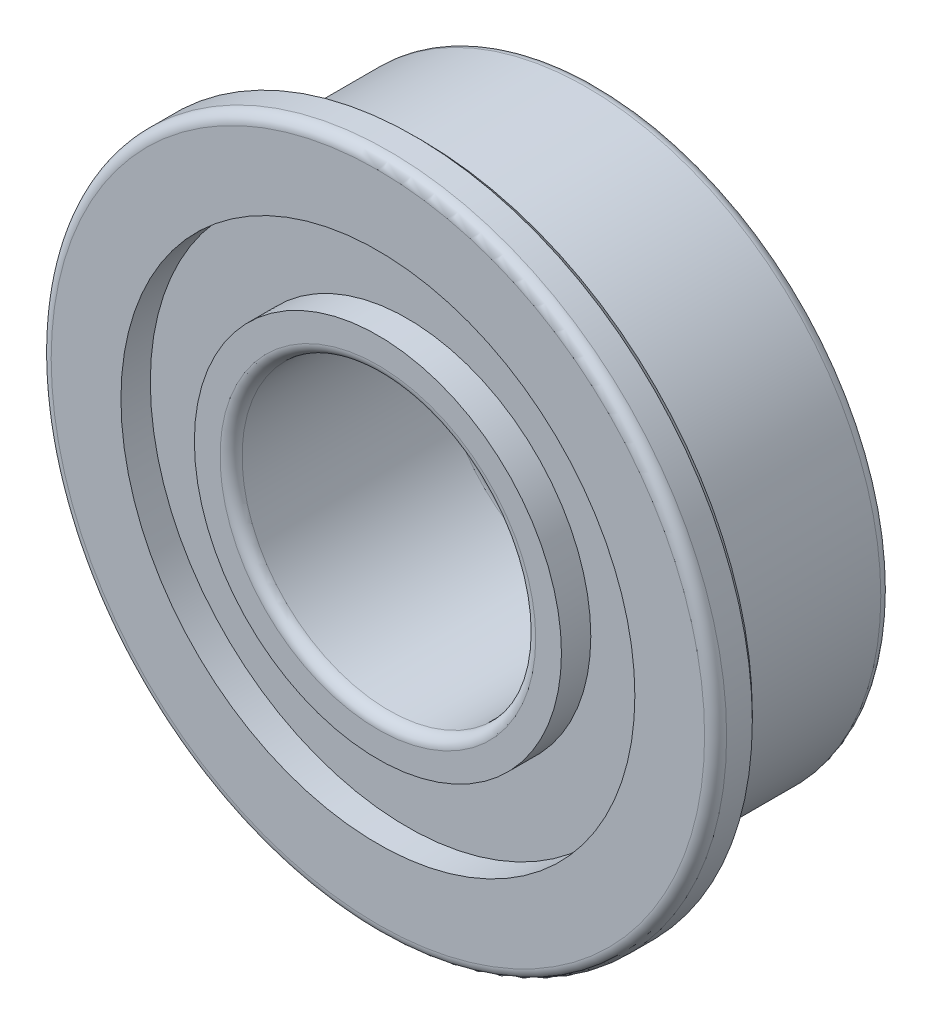
ISO-10303-21;
HEADER;
FILE_DESCRIPTION(('STEP AP214'),'2;1');
FILE_NAME('part.step','',(''),(''),'','','');
FILE_SCHEMA(('AUTOMOTIVE_DESIGN { 1 0 10303 214 1 1 1 1 }'));
ENDSEC;
DATA;
#1=APPLICATION_CONTEXT('core data for automotive mechanical design processes');
#2=APPLICATION_PROTOCOL_DEFINITION('international standard','automotive_design',2000,#1);
#3=PRODUCT_CONTEXT('',#1,'mechanical');
#4=PRODUCT('Part','Part','',(#3));
#5=PRODUCT_RELATED_PRODUCT_CATEGORY('part','',(#4));
#6=PRODUCT_DEFINITION_FORMATION('','',#4);
#7=PRODUCT_DEFINITION_CONTEXT('part definition',#1,'design');
#8=PRODUCT_DEFINITION('design','',#6,#7);
#9=PRODUCT_DEFINITION_SHAPE('','',#8);
#10=(LENGTH_UNIT() NAMED_UNIT(*) SI_UNIT(.MILLI.,.METRE.));
#11=(NAMED_UNIT(*) PLANE_ANGLE_UNIT() SI_UNIT($,.RADIAN.));
#12=(NAMED_UNIT(*) SI_UNIT($,.STERADIAN.) SOLID_ANGLE_UNIT());
#13=UNCERTAINTY_MEASURE_WITH_UNIT(LENGTH_MEASURE(1.E-05),#10,'distance_accuracy_value','');
#14=(GEOMETRIC_REPRESENTATION_CONTEXT(3) GLOBAL_UNCERTAINTY_ASSIGNED_CONTEXT((#13)) GLOBAL_UNIT_ASSIGNED_CONTEXT((#10,
#11,#12)) REPRESENTATION_CONTEXT('',''));
#15=CARTESIAN_POINT('',(0.,0.,0.));
#16=DIRECTION('',(0.,0.,1.));
#17=DIRECTION('',(1.,0.,0.));
#18=AXIS2_PLACEMENT_3D('',#15,#16,#17);
#19=CARTESIAN_POINT('',(0.,0.,3.));
#20=DIRECTION('',(0.,0.,1.));
#21=DIRECTION('',(1.,0.,0.));
#22=AXIS2_PLACEMENT_3D('',#19,#20,#21);
#23=PLANE('',#22);
#24=CARTESIAN_POINT('',(0.,0.,3.));
#25=DIRECTION('',(0.,0.,1.));
#26=DIRECTION('',(1.,0.,0.));
#27=AXIS2_PLACEMENT_3D('',#24,#25,#26);
#28=CIRCLE('',#27,2.15);
#29=CARTESIAN_POINT('',(2.15,0.,3.));
#30=VERTEX_POINT('',#29);
#31=EDGE_CURVE('E59',#30,#30,#28,.F.);
#32=ORIENTED_EDGE('',*,*,#31,.T.);
#33=EDGE_LOOP('',(#32));
#34=FACE_BOUND('',#33,.T.);
#35=CARTESIAN_POINT('',(0.,0.,3.));
#36=DIRECTION('',(0.,0.,1.));
#37=DIRECTION('',(1.,0.,0.));
#38=AXIS2_PLACEMENT_3D('',#35,#36,#37);
#39=CIRCLE('',#38,2.5);
#40=CARTESIAN_POINT('',(2.5,0.,3.));
#41=VERTEX_POINT('',#40);
#42=EDGE_CURVE('E102',#41,#41,#39,.T.);
#43=ORIENTED_EDGE('',*,*,#42,.T.);
#44=EDGE_LOOP('',(#43));
#45=FACE_BOUND('',#44,.T.);
#46=ADVANCED_FACE('F39',(#34,#45),#23,.T.);
#47=CARTESIAN_POINT('',(0.,0.,0.));
#48=DIRECTION('',(0.,0.,1.));
#49=DIRECTION('',(1.,0.,0.));
#50=AXIS2_PLACEMENT_3D('',#47,#48,#49);
#51=PLANE('',#50);
#52=CARTESIAN_POINT('',(0.,0.,0.));
#53=DIRECTION('',(0.,0.,1.));
#54=DIRECTION('',(1.,0.,0.));
#55=AXIS2_PLACEMENT_3D('',#52,#53,#54);
#56=CIRCLE('',#55,2.35);
#57=CARTESIAN_POINT('',(2.35,0.,0.));
#58=VERTEX_POINT('',#57);
#59=EDGE_CURVE('E77',#58,#58,#56,.F.);
#60=ORIENTED_EDGE('',*,*,#59,.T.);
#61=EDGE_LOOP('',(#60));
#62=FACE_BOUND('',#61,.T.);
#63=CARTESIAN_POINT('',(0.,0.,0.));
#64=DIRECTION('',(0.,0.,1.));
#65=DIRECTION('',(1.,0.,0.));
#66=AXIS2_PLACEMENT_3D('',#63,#64,#65);
#67=CIRCLE('',#66,2.15);
#68=CARTESIAN_POINT('',(2.15,0.,0.));
#69=VERTEX_POINT('',#68);
#70=EDGE_CURVE('E80',#69,#69,#67,.T.);
#71=ORIENTED_EDGE('',*,*,#70,.T.);
#72=EDGE_LOOP('',(#71));
#73=FACE_BOUND('',#72,.T.);
#74=ADVANCED_FACE('F137',(#62,#73),#51,.F.);
#75=CARTESIAN_POINT('',(0.,0.,3.));
#76=DIRECTION('',(0.,0.,-1.));
#77=DIRECTION('',(-1.,0.,0.));
#78=AXIS2_PLACEMENT_3D('',#75,#76,#77);
#79=CYLINDRICAL_SURFACE('',#78,4.);
#80=CARTESIAN_POINT('',(0.,0.,0.15));
#81=DIRECTION('',(0.,0.,1.));
#82=DIRECTION('',(1.,0.,0.));
#83=AXIS2_PLACEMENT_3D('',#80,#81,#82);
#84=CIRCLE('',#83,4.);
#85=CARTESIAN_POINT('',(4.,0.,0.15));
#86=VERTEX_POINT('',#85);
#87=EDGE_CURVE('E71',#86,#86,#84,.T.);
#88=ORIENTED_EDGE('',*,*,#87,.T.);
#89=EDGE_LOOP('',(#88));
#90=FACE_BOUND('',#89,.T.);
#91=CARTESIAN_POINT('',(0.,0.,2.4));
#92=DIRECTION('',(0.,0.,1.));
#93=DIRECTION('',(1.,0.,0.));
#94=AXIS2_PLACEMENT_3D('',#91,#92,#93);
#95=CIRCLE('',#94,4.);
#96=CARTESIAN_POINT('',(4.,0.,2.4));
#97=VERTEX_POINT('',#96);
#98=EDGE_CURVE('E83',#97,#97,#95,.T.);
#99=ORIENTED_EDGE('',*,*,#98,.F.);
#100=EDGE_LOOP('',(#99));
#101=FACE_BOUND('',#100,.T.);
#102=ADVANCED_FACE('F127',(#90,#101),#79,.T.);
#103=CARTESIAN_POINT('',(0.,0.,3.));
#104=DIRECTION('',(0.,0.,1.));
#105=DIRECTION('',(1.,0.,0.));
#106=AXIS2_PLACEMENT_3D('',#103,#104,#105);
#107=CIRCLE('',#106,4.45);
#108=CARTESIAN_POINT('',(4.45,0.,3.));
#109=VERTEX_POINT('',#108);
#110=EDGE_CURVE('E54',#109,#109,#107,.T.);
#111=ORIENTED_EDGE('',*,*,#110,.T.);
#112=EDGE_LOOP('',(#111));
#113=FACE_BOUND('',#112,.T.);
#114=CARTESIAN_POINT('',(0.,0.,3.));
#115=DIRECTION('',(0.,0.,1.));
#116=DIRECTION('',(1.,0.,0.));
#117=AXIS2_PLACEMENT_3D('',#114,#115,#116);
#118=CIRCLE('',#117,3.5);
#119=CARTESIAN_POINT('',(3.5,0.,3.));
#120=VERTEX_POINT('',#119);
#121=EDGE_CURVE('E96',#120,#120,#118,.T.);
#122=ORIENTED_EDGE('',*,*,#121,.F.);
#123=EDGE_LOOP('',(#122));
#124=FACE_BOUND('',#123,.T.);
#125=ADVANCED_FACE('F124',(#113,#124),#23,.T.);
#126=CARTESIAN_POINT('',(0.,0.,0.));
#127=DIRECTION('',(0.,0.,1.));
#128=DIRECTION('',(1.,0.,0.));
#129=AXIS2_PLACEMENT_3D('',#126,#127,#128);
#130=CIRCLE('',#129,3.85);
#131=CARTESIAN_POINT('',(3.85,0.,0.));
#132=VERTEX_POINT('',#131);
#133=EDGE_CURVE('E68',#132,#132,#130,.F.);
#134=ORIENTED_EDGE('',*,*,#133,.T.);
#135=EDGE_LOOP('',(#134));
#136=FACE_BOUND('',#135,.T.);
#137=CARTESIAN_POINT('',(0.,0.,0.));
#138=DIRECTION('',(0.,0.,-1.));
#139=DIRECTION('',(-1.,0.,0.));
#140=AXIS2_PLACEMENT_3D('',#137,#138,#139);
#141=CIRCLE('',#140,3.5);
#142=CARTESIAN_POINT('',(-3.5,0.,0.));
#143=VERTEX_POINT('',#142);
#144=EDGE_CURVE('E87',#143,#143,#141,.T.);
#145=ORIENTED_EDGE('',*,*,#144,.F.);
#146=EDGE_LOOP('',(#145));
#147=FACE_BOUND('',#146,.T.);
#148=ADVANCED_FACE('F126',(#136,#147),#51,.F.);
#149=CARTESIAN_POINT('',(0.,0.,3.));
#150=DIRECTION('',(0.,0.,-1.));
#151=DIRECTION('',(-1.,0.,0.));
#152=AXIS2_PLACEMENT_3D('',#149,#150,#151);
#153=CYLINDRICAL_SURFACE('',#152,2.);
#154=CARTESIAN_POINT('',(0.,0.,0.15));
#155=DIRECTION('',(0.,0.,1.));
#156=DIRECTION('',(1.,0.,0.));
#157=AXIS2_PLACEMENT_3D('',#154,#155,#156);
#158=CIRCLE('',#157,2.);
#159=CARTESIAN_POINT('',(2.,0.,0.15));
#160=VERTEX_POINT('',#159);
#161=EDGE_CURVE('E62',#160,#160,#158,.F.);
#162=ORIENTED_EDGE('',*,*,#161,.T.);
#163=EDGE_LOOP('',(#162));
#164=FACE_BOUND('',#163,.T.);
#165=CARTESIAN_POINT('',(0.,0.,2.85));
#166=DIRECTION('',(0.,0.,1.));
#167=DIRECTION('',(1.,0.,0.));
#168=AXIS2_PLACEMENT_3D('',#165,#166,#167);
#169=CIRCLE('',#168,2.);
#170=CARTESIAN_POINT('',(2.,0.,2.85));
#171=VERTEX_POINT('',#170);
#172=EDGE_CURVE('E65',#171,#171,#169,.T.);
#173=ORIENTED_EDGE('',*,*,#172,.T.);
#174=EDGE_LOOP('',(#173));
#175=FACE_BOUND('',#174,.T.);
#176=ADVANCED_FACE('F134',(#164,#175),#153,.F.);
#177=CARTESIAN_POINT('',(0.,0.,2.4));
#178=DIRECTION('',(0.,0.,1.));
#179=DIRECTION('',(1.,0.,0.));
#180=AXIS2_PLACEMENT_3D('',#177,#178,#179);
#181=CYLINDRICAL_SURFACE('',#180,4.6);
#182=CARTESIAN_POINT('',(0.,0.,2.5));
#183=DIRECTION('',(0.,0.,1.));
#184=DIRECTION('',(1.,0.,0.));
#185=AXIS2_PLACEMENT_3D('',#182,#183,#184);
#186=CIRCLE('',#185,4.6);
#187=CARTESIAN_POINT('',(4.6,0.,2.5));
#188=VERTEX_POINT('',#187);
#189=EDGE_CURVE('E46',#188,#188,#186,.T.);
#190=ORIENTED_EDGE('',*,*,#189,.T.);
#191=EDGE_LOOP('',(#190));
#192=FACE_BOUND('',#191,.T.);
#193=CARTESIAN_POINT('',(0.,0.,2.85));
#194=DIRECTION('',(0.,0.,1.));
#195=DIRECTION('',(1.,0.,0.));
#196=AXIS2_PLACEMENT_3D('',#193,#194,#195);
#197=CIRCLE('',#196,4.6);
#198=CARTESIAN_POINT('',(4.6,0.,2.85));
#199=VERTEX_POINT('',#198);
#200=EDGE_CURVE('E50',#199,#199,#197,.F.);
#201=ORIENTED_EDGE('',*,*,#200,.T.);
#202=EDGE_LOOP('',(#201));
#203=FACE_BOUND('',#202,.T.);
#204=ADVANCED_FACE('F174',(#192,#203),#181,.T.);
#205=CARTESIAN_POINT('',(0.,0.,2.4));
#206=DIRECTION('',(0.,0.,1.));
#207=DIRECTION('',(1.,0.,0.));
#208=AXIS2_PLACEMENT_3D('',#205,#206,#207);
#209=PLANE('',#208);
#210=CARTESIAN_POINT('',(0.,0.,2.4));
#211=DIRECTION('',(0.,0.,1.));
#212=DIRECTION('',(1.,0.,0.));
#213=AXIS2_PLACEMENT_3D('',#210,#211,#212);
#214=CIRCLE('',#213,4.5);
#215=CARTESIAN_POINT('',(4.5,0.,2.4));
#216=VERTEX_POINT('',#215);
#217=EDGE_CURVE('E10',#216,#216,#214,.F.);
#218=ORIENTED_EDGE('',*,*,#217,.T.);
#219=EDGE_LOOP('',(#218));
#220=FACE_BOUND('',#219,.T.);
#221=ORIENTED_EDGE('',*,*,#98,.T.);
#222=EDGE_LOOP('',(#221));
#223=FACE_BOUND('',#222,.T.);
#224=ADVANCED_FACE('F170',(#220,#223),#209,.F.);
#225=CARTESIAN_POINT('',(0.,0.,0.2));
#226=DIRECTION('',(0.,0.,-1.));
#227=DIRECTION('',(-1.,0.,0.));
#228=AXIS2_PLACEMENT_3D('',#225,#226,#227);
#229=CYLINDRICAL_SURFACE('',#228,3.5);
#230=CARTESIAN_POINT('',(0.,0.,0.2));
#231=DIRECTION('',(0.,0.,-1.));
#232=DIRECTION('',(-1.,0.,0.));
#233=AXIS2_PLACEMENT_3D('',#230,#231,#232);
#234=CIRCLE('',#233,3.5);
#235=CARTESIAN_POINT('',(-3.5,0.,0.2));
#236=VERTEX_POINT('',#235);
#237=EDGE_CURVE('E86',#236,#236,#234,.T.);
#238=ORIENTED_EDGE('',*,*,#237,.F.);
#239=EDGE_LOOP('',(#238));
#240=FACE_BOUND('',#239,.T.);
#241=ORIENTED_EDGE('',*,*,#144,.T.);
#242=EDGE_LOOP('',(#241));
#243=FACE_BOUND('',#242,.T.);
#244=ADVANCED_FACE('F166',(#240,#243),#229,.F.);
#245=CARTESIAN_POINT('',(0.,0.,0.2));
#246=DIRECTION('',(0.,0.,-1.));
#247=DIRECTION('',(-1.,0.,0.));
#248=AXIS2_PLACEMENT_3D('',#245,#246,#247);
#249=PLANE('',#248);
#250=CARTESIAN_POINT('',(0.,0.,0.2));
#251=DIRECTION('',(0.,0.,-1.));
#252=DIRECTION('',(-1.,0.,0.));
#253=AXIS2_PLACEMENT_3D('',#250,#251,#252);
#254=CIRCLE('',#253,2.5);
#255=CARTESIAN_POINT('',(-2.5,0.,0.2));
#256=VERTEX_POINT('',#255);
#257=EDGE_CURVE('E90',#256,#256,#254,.T.);
#258=ORIENTED_EDGE('',*,*,#257,.F.);
#259=EDGE_LOOP('',(#258));
#260=FACE_BOUND('',#259,.T.);
#261=ORIENTED_EDGE('',*,*,#237,.T.);
#262=EDGE_LOOP('',(#261));
#263=FACE_BOUND('',#262,.T.);
#264=ADVANCED_FACE('F162',(#260,#263),#249,.T.);
#265=CARTESIAN_POINT('',(0.,0.,0.2));
#266=DIRECTION('',(0.,0.,-1.));
#267=DIRECTION('',(-1.,0.,0.));
#268=AXIS2_PLACEMENT_3D('',#265,#266,#267);
#269=CYLINDRICAL_SURFACE('',#268,2.5);
#270=CARTESIAN_POINT('',(0.,0.,0.15));
#271=DIRECTION('',(0.,0.,1.));
#272=DIRECTION('',(1.,0.,0.));
#273=AXIS2_PLACEMENT_3D('',#270,#271,#272);
#274=CIRCLE('',#273,2.5);
#275=CARTESIAN_POINT('',(2.5,0.,0.15));
#276=VERTEX_POINT('',#275);
#277=EDGE_CURVE('E74',#276,#276,#274,.T.);
#278=ORIENTED_EDGE('',*,*,#277,.T.);
#279=EDGE_LOOP('',(#278));
#280=FACE_BOUND('',#279,.T.);
#281=ORIENTED_EDGE('',*,*,#257,.T.);
#282=EDGE_LOOP('',(#281));
#283=FACE_BOUND('',#282,.T.);
#284=ADVANCED_FACE('F120',(#280,#283),#269,.T.);
#285=CARTESIAN_POINT('',(0.,0.,2.6));
#286=DIRECTION('',(0.,0.,1.));
#287=DIRECTION('',(1.,0.,0.));
#288=AXIS2_PLACEMENT_3D('',#285,#286,#287);
#289=CYLINDRICAL_SURFACE('',#288,3.5);
#290=CARTESIAN_POINT('',(0.,0.,2.6));
#291=DIRECTION('',(0.,0.,1.));
#292=DIRECTION('',(1.,0.,0.));
#293=AXIS2_PLACEMENT_3D('',#290,#291,#292);
#294=CIRCLE('',#293,3.5);
#295=CARTESIAN_POINT('',(3.5,0.,2.6));
#296=VERTEX_POINT('',#295);
#297=EDGE_CURVE('E95',#296,#296,#294,.T.);
#298=ORIENTED_EDGE('',*,*,#297,.F.);
#299=EDGE_LOOP('',(#298));
#300=FACE_BOUND('',#299,.T.);
#301=ORIENTED_EDGE('',*,*,#121,.T.);
#302=EDGE_LOOP('',(#301));
#303=FACE_BOUND('',#302,.T.);
#304=ADVANCED_FACE('F114',(#300,#303),#289,.F.);
#305=CARTESIAN_POINT('',(0.,0.,2.6));
#306=DIRECTION('',(0.,0.,1.));
#307=DIRECTION('',(1.,0.,0.));
#308=AXIS2_PLACEMENT_3D('',#305,#306,#307);
#309=PLANE('',#308);
#310=CARTESIAN_POINT('',(0.,0.,2.6));
#311=DIRECTION('',(0.,0.,1.));
#312=DIRECTION('',(1.,0.,0.));
#313=AXIS2_PLACEMENT_3D('',#310,#311,#312);
#314=CIRCLE('',#313,2.5);
#315=CARTESIAN_POINT('',(2.5,0.,2.6));
#316=VERTEX_POINT('',#315);
#317=EDGE_CURVE('E99',#316,#316,#314,.T.);
#318=ORIENTED_EDGE('',*,*,#317,.F.);
#319=EDGE_LOOP('',(#318));
#320=FACE_BOUND('',#319,.T.);
#321=ORIENTED_EDGE('',*,*,#297,.T.);
#322=EDGE_LOOP('',(#321));
#323=FACE_BOUND('',#322,.T.);
#324=ADVANCED_FACE('F111',(#320,#323),#309,.T.);
#325=CARTESIAN_POINT('',(0.,0.,2.6));
#326=DIRECTION('',(0.,0.,1.));
#327=DIRECTION('',(1.,0.,0.));
#328=AXIS2_PLACEMENT_3D('',#325,#326,#327);
#329=CYLINDRICAL_SURFACE('',#328,2.5);
#330=ORIENTED_EDGE('',*,*,#317,.T.);
#331=EDGE_LOOP('',(#330));
#332=FACE_BOUND('',#331,.T.);
#333=ORIENTED_EDGE('',*,*,#42,.F.);
#334=EDGE_LOOP('',(#333));
#335=FACE_BOUND('',#334,.T.);
#336=ADVANCED_FACE('F108',(#332,#335),#329,.T.);
#337=CARTESIAN_POINT('',(0.,0.,0.15));
#338=DIRECTION('',(0.,0.,1.));
#339=DIRECTION('',(1.,0.,0.));
#340=AXIS2_PLACEMENT_3D('',#337,#338,#339);
#341=TOROIDAL_SURFACE('',#340,2.35,0.15);
#342=ORIENTED_EDGE('',*,*,#277,.F.);
#343=EDGE_LOOP('',(#342));
#344=FACE_BOUND('',#343,.T.);
#345=ORIENTED_EDGE('',*,*,#59,.F.);
#346=EDGE_LOOP('',(#345));
#347=FACE_BOUND('',#346,.T.);
#348=ADVANCED_FACE('F151',(#344,#347),#341,.T.);
#349=CARTESIAN_POINT('',(0.,0.,0.15));
#350=DIRECTION('',(0.,0.,1.));
#351=DIRECTION('',(1.,0.,0.));
#352=AXIS2_PLACEMENT_3D('',#349,#350,#351);
#353=TOROIDAL_SURFACE('',#352,3.85,0.15);
#354=ORIENTED_EDGE('',*,*,#133,.F.);
#355=EDGE_LOOP('',(#354));
#356=FACE_BOUND('',#355,.T.);
#357=ORIENTED_EDGE('',*,*,#87,.F.);
#358=EDGE_LOOP('',(#357));
#359=FACE_BOUND('',#358,.T.);
#360=ADVANCED_FACE('F156',(#356,#359),#353,.T.);
#361=CARTESIAN_POINT('',(0.,0.,0.15));
#362=DIRECTION('',(0.,0.,1.));
#363=DIRECTION('',(1.,0.,0.));
#364=AXIS2_PLACEMENT_3D('',#361,#362,#363);
#365=TOROIDAL_SURFACE('',#364,2.15,0.15);
#366=ORIENTED_EDGE('',*,*,#161,.F.);
#367=EDGE_LOOP('',(#366));
#368=FACE_BOUND('',#367,.T.);
#369=ORIENTED_EDGE('',*,*,#70,.F.);
#370=EDGE_LOOP('',(#369));
#371=FACE_BOUND('',#370,.T.);
#372=ADVANCED_FACE('F187',(#368,#371),#365,.T.);
#373=CARTESIAN_POINT('',(0.,0.,2.85));
#374=DIRECTION('',(0.,0.,1.));
#375=DIRECTION('',(1.,0.,0.));
#376=AXIS2_PLACEMENT_3D('',#373,#374,#375);
#377=TOROIDAL_SURFACE('',#376,2.15,0.15);
#378=ORIENTED_EDGE('',*,*,#31,.F.);
#379=EDGE_LOOP('',(#378));
#380=FACE_BOUND('',#379,.T.);
#381=ORIENTED_EDGE('',*,*,#172,.F.);
#382=EDGE_LOOP('',(#381));
#383=FACE_BOUND('',#382,.T.);
#384=ADVANCED_FACE('F184',(#380,#383),#377,.T.);
#385=CARTESIAN_POINT('',(0.,0.,2.85));
#386=DIRECTION('',(0.,0.,1.));
#387=DIRECTION('',(1.,0.,0.));
#388=AXIS2_PLACEMENT_3D('',#385,#386,#387);
#389=TOROIDAL_SURFACE('',#388,4.45,0.15);
#390=ORIENTED_EDGE('',*,*,#200,.F.);
#391=EDGE_LOOP('',(#390));
#392=FACE_BOUND('',#391,.T.);
#393=ORIENTED_EDGE('',*,*,#110,.F.);
#394=EDGE_LOOP('',(#393));
#395=FACE_BOUND('',#394,.T.);
#396=ADVANCED_FACE('F186',(#392,#395),#389,.T.);
#397=CARTESIAN_POINT('',(0.,0.,2.5));
#398=DIRECTION('',(0.,0.,1.));
#399=DIRECTION('',(1.,0.,0.));
#400=AXIS2_PLACEMENT_3D('',#397,#398,#399);
#401=CONICAL_SURFACE('',#400,4.6,0.785398163397448);
#402=ORIENTED_EDGE('',*,*,#217,.F.);
#403=EDGE_LOOP('',(#402));
#404=FACE_BOUND('',#403,.T.);
#405=ORIENTED_EDGE('',*,*,#189,.F.);
#406=EDGE_LOOP('',(#405));
#407=FACE_BOUND('',#406,.T.);
#408=ADVANCED_FACE('F41',(#404,#407),#401,.T.);
#409=CLOSED_SHELL('',(#46,#74,#102,#125,#148,#176,#204,#224,#244,#264,#284,#304,#324,#336,#348,
#360,#372,#384,#396,#408));
#410=MANIFOLD_SOLID_BREP('B2',#409);
#411=ADVANCED_BREP_SHAPE_REPRESENTATION('',(#18,#410),#14);
#412=SHAPE_DEFINITION_REPRESENTATION(#9,#411);
ENDSEC;
END-ISO-10303-21;
